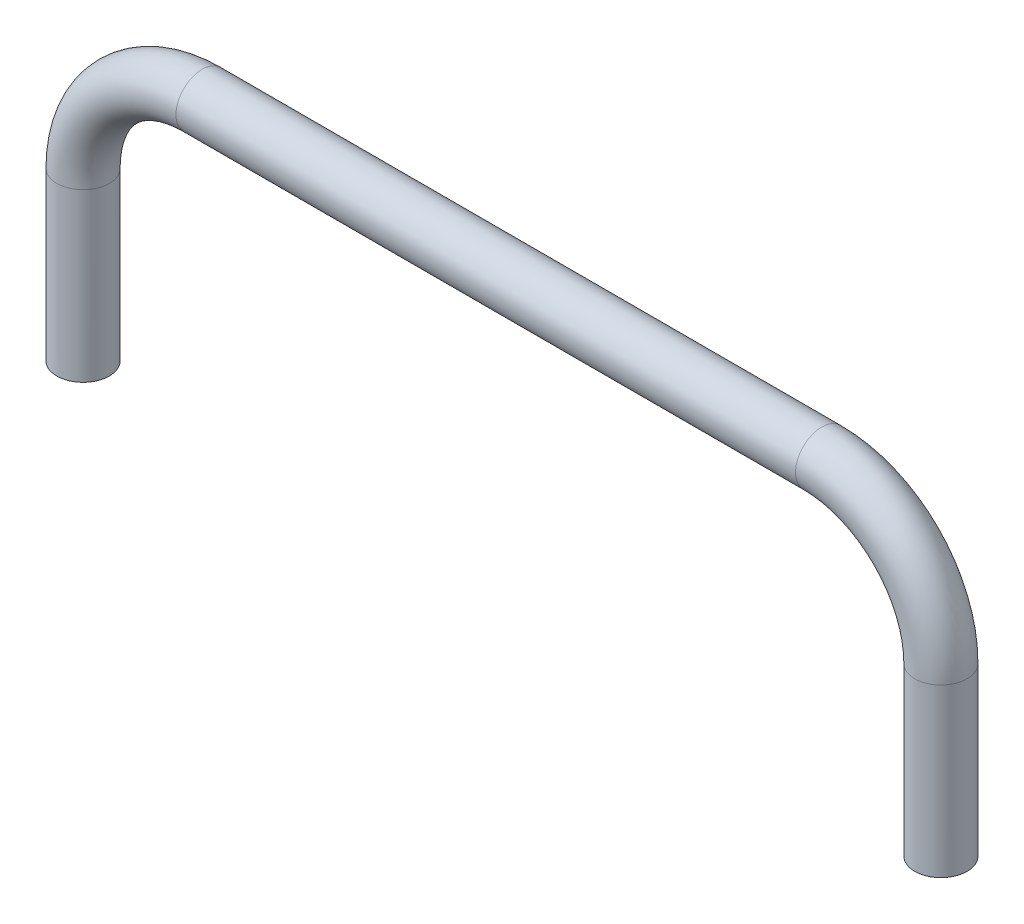
ISO-10303-21;
HEADER;
FILE_DESCRIPTION(('STEP AP214'),'2;1');
FILE_NAME('part.step','',(''),(''),'','','');
FILE_SCHEMA(('AUTOMOTIVE_DESIGN { 1 0 10303 214 1 1 1 1 }'));
ENDSEC;
DATA;
#1=APPLICATION_CONTEXT('core data for automotive mechanical design processes');
#2=APPLICATION_PROTOCOL_DEFINITION('international standard','automotive_design',2000,#1);
#3=PRODUCT_CONTEXT('',#1,'mechanical');
#4=PRODUCT('Part','Part','',(#3));
#5=PRODUCT_RELATED_PRODUCT_CATEGORY('part','',(#4));
#6=PRODUCT_DEFINITION_FORMATION('','',#4);
#7=PRODUCT_DEFINITION_CONTEXT('part definition',#1,'design');
#8=PRODUCT_DEFINITION('design','',#6,#7);
#9=PRODUCT_DEFINITION_SHAPE('','',#8);
#10=(LENGTH_UNIT() NAMED_UNIT(*) SI_UNIT(.MILLI.,.METRE.));
#11=(NAMED_UNIT(*) PLANE_ANGLE_UNIT() SI_UNIT($,.RADIAN.));
#12=(NAMED_UNIT(*) SI_UNIT($,.STERADIAN.) SOLID_ANGLE_UNIT());
#13=UNCERTAINTY_MEASURE_WITH_UNIT(LENGTH_MEASURE(1.E-05),#10,'distance_accuracy_value','');
#14=(GEOMETRIC_REPRESENTATION_CONTEXT(3) GLOBAL_UNCERTAINTY_ASSIGNED_CONTEXT((#13)) GLOBAL_UNIT_ASSIGNED_CONTEXT((#10,
#11,#12)) REPRESENTATION_CONTEXT('',''));
#15=CARTESIAN_POINT('',(0.,0.,0.));
#16=DIRECTION('',(0.,0.,1.));
#17=DIRECTION('',(1.,0.,0.));
#18=AXIS2_PLACEMENT_3D('',#15,#16,#17);
#19=CARTESIAN_POINT('',(180.,1.42742960308949E-13,0.));
#20=DIRECTION('',(0.,-1.,0.));
#21=DIRECTION('',(0.,0.,1.));
#22=AXIS2_PLACEMENT_3D('',#19,#20,#21);
#23=PLANE('',#22);
#24=CARTESIAN_POINT('',(180.,1.42742960308949E-13,0.));
#25=DIRECTION('',(0.,-1.,0.));
#26=DIRECTION('',(0.,0.,1.));
#27=AXIS2_PLACEMENT_3D('',#24,#25,#26);
#28=CIRCLE('',#27,11.);
#29=CARTESIAN_POINT('',(180.,1.42742960308949E-13,11.));
#30=VERTEX_POINT('',#29);
#31=EDGE_CURVE('E47',#30,#30,#28,.T.);
#32=ORIENTED_EDGE('',*,*,#31,.T.);
#33=EDGE_LOOP('',(#32));
#34=FACE_BOUND('',#33,.T.);
#35=ADVANCED_FACE('F35',(#34),#23,.T.);
#36=CARTESIAN_POINT('',(-180.,0.,0.));
#37=DIRECTION('',(0.,1.,0.));
#38=DIRECTION('',(0.,0.,1.));
#39=AXIS2_PLACEMENT_3D('',#36,#37,#38);
#40=PLANE('',#39);
#41=CARTESIAN_POINT('',(-180.,0.,0.));
#42=DIRECTION('',(0.,1.,0.));
#43=DIRECTION('',(0.,0.,1.));
#44=AXIS2_PLACEMENT_3D('',#41,#42,#43);
#45=CIRCLE('',#44,11.);
#46=CARTESIAN_POINT('',(-180.,0.,11.));
#47=VERTEX_POINT('',#46);
#48=EDGE_CURVE('E11',#47,#47,#45,.T.);
#49=ORIENTED_EDGE('',*,*,#48,.F.);
#50=EDGE_LOOP('',(#49));
#51=FACE_BOUND('',#50,.T.);
#52=ADVANCED_FACE('F53',(#51),#40,.F.);
#53=CARTESIAN_POINT('',(180.,1.42742960308949E-13,0.));
#54=DIRECTION('',(0.,1.,0.));
#55=DIRECTION('',(-1.,0.,0.));
#56=AXIS2_PLACEMENT_3D('',#53,#54,#55);
#57=CYLINDRICAL_SURFACE('',#56,11.);
#58=CARTESIAN_POINT('',(180.,70.0000000000001,0.));
#59=DIRECTION('',(0.,-1.,0.));
#60=DIRECTION('',(0.,0.,1.));
#61=AXIS2_PLACEMENT_3D('',#58,#59,#60);
#62=CIRCLE('',#61,11.);
#63=CARTESIAN_POINT('',(191.,70.0000000000001,0.));
#64=VERTEX_POINT('',#63);
#65=EDGE_CURVE('E87',#64,#64,#62,.T.);
#66=ORIENTED_EDGE('',*,*,#65,.T.);
#67=EDGE_LOOP('',(#66));
#68=FACE_BOUND('',#67,.T.);
#69=ORIENTED_EDGE('',*,*,#31,.F.);
#70=EDGE_LOOP('',(#69));
#71=FACE_BOUND('',#70,.T.);
#72=ADVANCED_FACE('F55',(#68,#71),#57,.T.);
#73=CARTESIAN_POINT('',(130.,70.0000000000001,0.));
#74=DIRECTION('',(0.,0.,1.));
#75=DIRECTION('',(1.,0.,0.));
#76=AXIS2_PLACEMENT_3D('',#73,#74,#75);
#77=TOROIDAL_SURFACE('',#76,50.,11.);
#78=CARTESIAN_POINT('',(130.,120.,0.));
#79=DIRECTION('',(1.,0.,0.));
#80=DIRECTION('',(0.,0.,1.));
#81=AXIS2_PLACEMENT_3D('',#78,#79,#80);
#82=CIRCLE('',#81,11.);
#83=CARTESIAN_POINT('',(130.,131.,0.));
#84=VERTEX_POINT('',#83);
#85=EDGE_CURVE('E84',#84,#84,#82,.T.);
#86=CARTESIAN_POINT('',(130.,70.0000000000001,0.));
#87=DIRECTION('',(0.,0.,1.));
#88=DIRECTION('',(1.,0.,0.));
#89=AXIS2_PLACEMENT_3D('',#86,#87,#88);
#90=CIRCLE('',#89,61.);
#91=EDGE_CURVE('',#64,#84,#90,.T.);
#92=ORIENTED_EDGE('',*,*,#65,.F.);
#93=ORIENTED_EDGE('',*,*,#85,.T.);
#94=ORIENTED_EDGE('',*,*,#91,.T.);
#95=ORIENTED_EDGE('',*,*,#91,.F.);
#96=EDGE_LOOP('',(#92,#94,#93,#95));
#97=FACE_BOUND('',#96,.T.);
#98=ADVANCED_FACE('F60',(#97),#77,.T.);
#99=CARTESIAN_POINT('',(130.,120.,0.));
#100=DIRECTION('',(-1.,0.,0.));
#101=DIRECTION('',(0.,-1.,0.));
#102=AXIS2_PLACEMENT_3D('',#99,#100,#101);
#103=CYLINDRICAL_SURFACE('',#102,11.);
#104=CARTESIAN_POINT('',(-130.,120.,0.));
#105=DIRECTION('',(1.,0.,0.));
#106=DIRECTION('',(0.,0.,1.));
#107=AXIS2_PLACEMENT_3D('',#104,#105,#106);
#108=CIRCLE('',#107,11.);
#109=CARTESIAN_POINT('',(-130.,131.,0.));
#110=VERTEX_POINT('',#109);
#111=EDGE_CURVE('E89',#110,#110,#108,.T.);
#112=ORIENTED_EDGE('',*,*,#111,.T.);
#113=EDGE_LOOP('',(#112));
#114=FACE_BOUND('',#113,.T.);
#115=ORIENTED_EDGE('',*,*,#85,.F.);
#116=EDGE_LOOP('',(#115));
#117=FACE_BOUND('',#116,.T.);
#118=ADVANCED_FACE('F70',(#114,#117),#103,.T.);
#119=CARTESIAN_POINT('',(-130.,70.,0.));
#120=DIRECTION('',(0.,0.,1.));
#121=DIRECTION('',(1.,0.,0.));
#122=AXIS2_PLACEMENT_3D('',#119,#120,#121);
#123=TOROIDAL_SURFACE('',#122,50.,11.);
#124=CARTESIAN_POINT('',(-180.,70.,0.));
#125=DIRECTION('',(0.,1.,0.));
#126=DIRECTION('',(0.,0.,1.));
#127=AXIS2_PLACEMENT_3D('',#124,#125,#126);
#128=CIRCLE('',#127,11.);
#129=CARTESIAN_POINT('',(-191.,70.,0.));
#130=VERTEX_POINT('',#129);
#131=EDGE_CURVE('E42',#130,#130,#128,.T.);
#132=CARTESIAN_POINT('',(-130.,70.,0.));
#133=DIRECTION('',(0.,0.,1.));
#134=DIRECTION('',(1.,0.,0.));
#135=AXIS2_PLACEMENT_3D('',#132,#133,#134);
#136=CIRCLE('',#135,61.);
#137=EDGE_CURVE('',#110,#130,#136,.T.);
#138=ORIENTED_EDGE('',*,*,#111,.F.);
#139=ORIENTED_EDGE('',*,*,#131,.T.);
#140=ORIENTED_EDGE('',*,*,#137,.T.);
#141=ORIENTED_EDGE('',*,*,#137,.F.);
#142=EDGE_LOOP('',(#138,#140,#139,#141));
#143=FACE_BOUND('',#142,.T.);
#144=ADVANCED_FACE('F66',(#143),#123,.T.);
#145=CARTESIAN_POINT('',(-180.,70.,0.));
#146=DIRECTION('',(0.,-1.,0.));
#147=DIRECTION('',(0.,0.,-1.));
#148=AXIS2_PLACEMENT_3D('',#145,#146,#147);
#149=CYLINDRICAL_SURFACE('',#148,11.);
#150=ORIENTED_EDGE('',*,*,#48,.T.);
#151=EDGE_LOOP('',(#150));
#152=FACE_BOUND('',#151,.T.);
#153=ORIENTED_EDGE('',*,*,#131,.F.);
#154=EDGE_LOOP('',(#153));
#155=FACE_BOUND('',#154,.T.);
#156=ADVANCED_FACE('F50',(#152,#155),#149,.T.);
#157=CLOSED_SHELL('',(#35,#52,#72,#98,#118,#144,#156));
#158=MANIFOLD_SOLID_BREP('B2',#157);
#159=ADVANCED_BREP_SHAPE_REPRESENTATION('',(#18,#158),#14);
#160=SHAPE_DEFINITION_REPRESENTATION(#9,#159);
ENDSEC;
END-ISO-10303-21;
